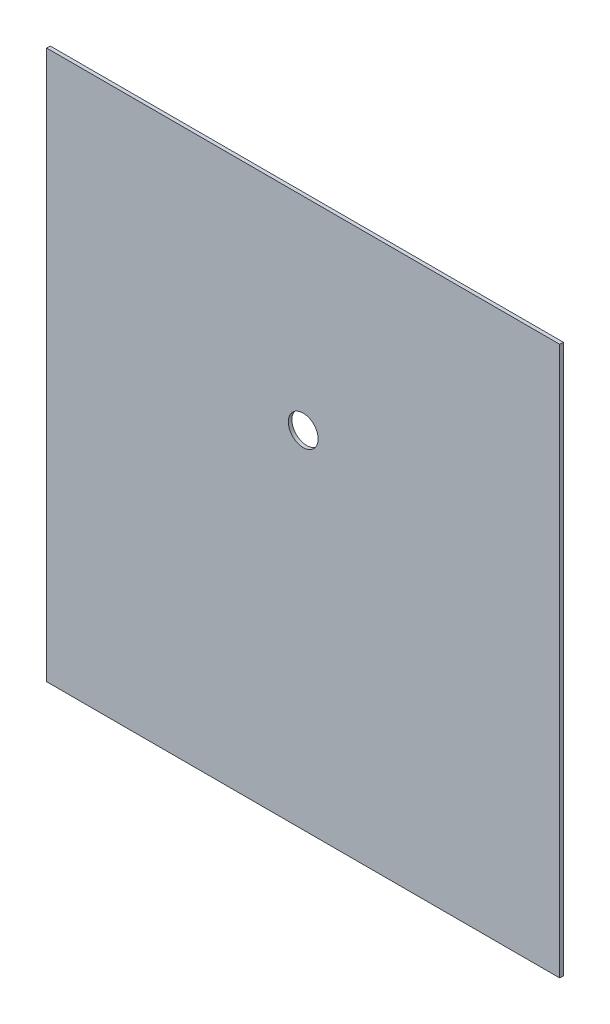
ISO-10303-21;
HEADER;
FILE_DESCRIPTION(('STEP AP214'),'2;1');
FILE_NAME('part.step','',(''),(''),'','','');
FILE_SCHEMA(('AUTOMOTIVE_DESIGN { 1 0 10303 214 1 1 1 1 }'));
ENDSEC;
DATA;
#1=APPLICATION_CONTEXT('core data for automotive mechanical design processes');
#2=APPLICATION_PROTOCOL_DEFINITION('international standard','automotive_design',2000,#1);
#3=PRODUCT_CONTEXT('',#1,'mechanical');
#4=PRODUCT('Part','Part','',(#3));
#5=PRODUCT_RELATED_PRODUCT_CATEGORY('part','',(#4));
#6=PRODUCT_DEFINITION_FORMATION('','',#4);
#7=PRODUCT_DEFINITION_CONTEXT('part definition',#1,'design');
#8=PRODUCT_DEFINITION('design','',#6,#7);
#9=PRODUCT_DEFINITION_SHAPE('','',#8);
#10=(LENGTH_UNIT() NAMED_UNIT(*) SI_UNIT(.MILLI.,.METRE.));
#11=(NAMED_UNIT(*) PLANE_ANGLE_UNIT() SI_UNIT($,.RADIAN.));
#12=(NAMED_UNIT(*) SI_UNIT($,.STERADIAN.) SOLID_ANGLE_UNIT());
#13=UNCERTAINTY_MEASURE_WITH_UNIT(LENGTH_MEASURE(1.E-05),#10,'distance_accuracy_value','');
#14=(GEOMETRIC_REPRESENTATION_CONTEXT(3) GLOBAL_UNCERTAINTY_ASSIGNED_CONTEXT((#13)) GLOBAL_UNIT_ASSIGNED_CONTEXT((#10,
#11,#12)) REPRESENTATION_CONTEXT('',''));
#15=CARTESIAN_POINT('',(0.,0.,0.));
#16=DIRECTION('',(0.,0.,1.));
#17=DIRECTION('',(1.,0.,0.));
#18=AXIS2_PLACEMENT_3D('',#15,#16,#17);
#19=CARTESIAN_POINT('',(0.,0.,3.));
#20=DIRECTION('',(0.,0.,1.));
#21=DIRECTION('',(1.,0.,0.));
#22=AXIS2_PLACEMENT_3D('',#19,#20,#21);
#23=PLANE('',#22);
#24=DIRECTION('',(0.,-1.,0.));
#25=VECTOR('',#24,1.);
#26=CARTESIAN_POINT('',(-215.,230.,3.));
#27=LINE('',#26,#25);
#28=CARTESIAN_POINT('',(-215.,230.,3.));
#29=VERTEX_POINT('',#28);
#30=CARTESIAN_POINT('',(-215.,-230.,3.));
#31=VERTEX_POINT('',#30);
#32=EDGE_CURVE('E85',#29,#31,#27,.T.);
#33=ORIENTED_EDGE('',*,*,#32,.T.);
#34=DIRECTION('',(1.,0.,0.));
#35=VECTOR('',#34,1.);
#36=CARTESIAN_POINT('',(-215.,-230.,3.));
#37=LINE('',#36,#35);
#38=CARTESIAN_POINT('',(215.,-230.,3.));
#39=VERTEX_POINT('',#38);
#40=EDGE_CURVE('E80',#31,#39,#37,.T.);
#41=ORIENTED_EDGE('',*,*,#40,.T.);
#42=DIRECTION('',(0.,1.,0.));
#43=VECTOR('',#42,1.);
#44=CARTESIAN_POINT('',(215.,230.,3.));
#45=LINE('',#44,#43);
#46=CARTESIAN_POINT('',(215.,230.,3.));
#47=VERTEX_POINT('',#46);
#48=EDGE_CURVE('E83',#39,#47,#45,.T.);
#49=ORIENTED_EDGE('',*,*,#48,.T.);
#50=DIRECTION('',(-1.,0.,0.));
#51=VECTOR('',#50,1.);
#52=CARTESIAN_POINT('',(-215.,230.,3.));
#53=LINE('',#52,#51);
#54=EDGE_CURVE('E50',#47,#29,#53,.T.);
#55=ORIENTED_EDGE('',*,*,#54,.T.);
#56=EDGE_LOOP('',(#33,#41,#49,#55));
#57=FACE_BOUND('',#56,.T.);
#58=CARTESIAN_POINT('',(0.,60.,3.));
#59=DIRECTION('',(0.,0.,1.));
#60=DIRECTION('',(1.,0.,0.));
#61=AXIS2_PLACEMENT_3D('',#58,#59,#60);
#62=CIRCLE('',#61,12.5);
#63=CARTESIAN_POINT('',(12.5,60.,3.));
#64=VERTEX_POINT('',#63);
#65=EDGE_CURVE('E100',#64,#64,#62,.T.);
#66=ORIENTED_EDGE('',*,*,#65,.F.);
#67=EDGE_LOOP('',(#66));
#68=FACE_BOUND('',#67,.T.);
#69=ADVANCED_FACE('F33',(#57,#68),#23,.T.);
#70=CARTESIAN_POINT('',(0.,0.,0.));
#71=DIRECTION('',(0.,0.,1.));
#72=DIRECTION('',(1.,0.,0.));
#73=AXIS2_PLACEMENT_3D('',#70,#71,#72);
#74=PLANE('',#73);
#75=DIRECTION('',(0.,-1.,0.));
#76=VECTOR('',#75,1.);
#77=CARTESIAN_POINT('',(-215.,230.,0.));
#78=LINE('',#77,#76);
#79=CARTESIAN_POINT('',(-215.,230.,0.));
#80=VERTEX_POINT('',#79);
#81=CARTESIAN_POINT('',(-215.,-230.,0.));
#82=VERTEX_POINT('',#81);
#83=EDGE_CURVE('E97',#80,#82,#78,.T.);
#84=ORIENTED_EDGE('',*,*,#83,.F.);
#85=DIRECTION('',(-1.,0.,0.));
#86=VECTOR('',#85,1.);
#87=CARTESIAN_POINT('',(-215.,230.,0.));
#88=LINE('',#87,#86);
#89=CARTESIAN_POINT('',(215.,230.,0.));
#90=VERTEX_POINT('',#89);
#91=EDGE_CURVE('E73',#90,#80,#88,.T.);
#92=ORIENTED_EDGE('',*,*,#91,.F.);
#93=DIRECTION('',(0.,1.,0.));
#94=VECTOR('',#93,1.);
#95=CARTESIAN_POINT('',(215.,230.,0.));
#96=LINE('',#95,#94);
#97=CARTESIAN_POINT('',(215.,-230.,0.));
#98=VERTEX_POINT('',#97);
#99=EDGE_CURVE('E67',#98,#90,#96,.T.);
#100=ORIENTED_EDGE('',*,*,#99,.F.);
#101=DIRECTION('',(1.,0.,0.));
#102=VECTOR('',#101,1.);
#103=CARTESIAN_POINT('',(-215.,-230.,0.));
#104=LINE('',#103,#102);
#105=EDGE_CURVE('E89',#82,#98,#104,.T.);
#106=ORIENTED_EDGE('',*,*,#105,.F.);
#107=EDGE_LOOP('',(#84,#92,#100,#106));
#108=FACE_BOUND('',#107,.T.);
#109=CARTESIAN_POINT('',(0.,60.,0.));
#110=DIRECTION('',(0.,0.,1.));
#111=DIRECTION('',(1.,0.,0.));
#112=AXIS2_PLACEMENT_3D('',#109,#110,#111);
#113=CIRCLE('',#112,12.5);
#114=CARTESIAN_POINT('',(12.5,60.,0.));
#115=VERTEX_POINT('',#114);
#116=EDGE_CURVE('E112',#115,#115,#113,.T.);
#117=ORIENTED_EDGE('',*,*,#116,.T.);
#118=EDGE_LOOP('',(#117));
#119=FACE_BOUND('',#118,.T.);
#120=ADVANCED_FACE('F108',(#108,#119),#74,.F.);
#121=CARTESIAN_POINT('',(-215.,230.,3.));
#122=DIRECTION('',(1.,0.,0.));
#123=DIRECTION('',(0.,1.,0.));
#124=AXIS2_PLACEMENT_3D('',#121,#122,#123);
#125=PLANE('',#124);
#126=ORIENTED_EDGE('',*,*,#83,.T.);
#127=DIRECTION('',(0.,0.,-1.));
#128=VECTOR('',#127,1.);
#129=CARTESIAN_POINT('',(-215.,-230.,3.));
#130=LINE('',#129,#128);
#131=EDGE_CURVE('E11',#31,#82,#130,.T.);
#132=ORIENTED_EDGE('',*,*,#131,.F.);
#133=ORIENTED_EDGE('',*,*,#32,.F.);
#134=DIRECTION('',(0.,0.,-1.));
#135=VECTOR('',#134,1.);
#136=CARTESIAN_POINT('',(-215.,230.,3.));
#137=LINE('',#136,#135);
#138=EDGE_CURVE('E93',#29,#80,#137,.T.);
#139=ORIENTED_EDGE('',*,*,#138,.T.);
#140=EDGE_LOOP('',(#126,#132,#133,#139));
#141=FACE_BOUND('',#140,.T.);
#142=ADVANCED_FACE('F35',(#141),#125,.F.);
#143=CARTESIAN_POINT('',(-215.,-230.,3.));
#144=DIRECTION('',(0.,1.,0.));
#145=DIRECTION('',(-1.,0.,0.));
#146=AXIS2_PLACEMENT_3D('',#143,#144,#145);
#147=PLANE('',#146);
#148=ORIENTED_EDGE('',*,*,#105,.T.);
#149=DIRECTION('',(0.,0.,-1.));
#150=VECTOR('',#149,1.);
#151=CARTESIAN_POINT('',(215.,-230.,3.));
#152=LINE('',#151,#150);
#153=EDGE_CURVE('E42',#39,#98,#152,.T.);
#154=ORIENTED_EDGE('',*,*,#153,.F.);
#155=ORIENTED_EDGE('',*,*,#40,.F.);
#156=ORIENTED_EDGE('',*,*,#131,.T.);
#157=EDGE_LOOP('',(#148,#154,#155,#156));
#158=FACE_BOUND('',#157,.T.);
#159=ADVANCED_FACE('F88',(#158),#147,.F.);
#160=CARTESIAN_POINT('',(215.,230.,3.));
#161=DIRECTION('',(-1.,0.,0.));
#162=DIRECTION('',(0.,-1.,0.));
#163=AXIS2_PLACEMENT_3D('',#160,#161,#162);
#164=PLANE('',#163);
#165=ORIENTED_EDGE('',*,*,#99,.T.);
#166=DIRECTION('',(0.,0.,-1.));
#167=VECTOR('',#166,1.);
#168=CARTESIAN_POINT('',(215.,230.,3.));
#169=LINE('',#168,#167);
#170=EDGE_CURVE('E90',#47,#90,#169,.T.);
#171=ORIENTED_EDGE('',*,*,#170,.F.);
#172=ORIENTED_EDGE('',*,*,#48,.F.);
#173=ORIENTED_EDGE('',*,*,#153,.T.);
#174=EDGE_LOOP('',(#165,#171,#172,#173));
#175=FACE_BOUND('',#174,.T.);
#176=ADVANCED_FACE('F91',(#175),#164,.F.);
#177=CARTESIAN_POINT('',(-215.,230.,3.));
#178=DIRECTION('',(0.,-1.,0.));
#179=DIRECTION('',(1.,0.,0.));
#180=AXIS2_PLACEMENT_3D('',#177,#178,#179);
#181=PLANE('',#180);
#182=ORIENTED_EDGE('',*,*,#91,.T.);
#183=ORIENTED_EDGE('',*,*,#138,.F.);
#184=ORIENTED_EDGE('',*,*,#54,.F.);
#185=ORIENTED_EDGE('',*,*,#170,.T.);
#186=EDGE_LOOP('',(#182,#183,#184,#185));
#187=FACE_BOUND('',#186,.T.);
#188=ADVANCED_FACE('F105',(#187),#181,.F.);
#189=CARTESIAN_POINT('',(0.,60.,3.));
#190=DIRECTION('',(0.,0.,-1.));
#191=DIRECTION('',(-1.,0.,0.));
#192=AXIS2_PLACEMENT_3D('',#189,#190,#191);
#193=CYLINDRICAL_SURFACE('',#192,12.5);
#194=ORIENTED_EDGE('',*,*,#65,.T.);
#195=EDGE_LOOP('',(#194));
#196=FACE_BOUND('',#195,.T.);
#197=ORIENTED_EDGE('',*,*,#116,.F.);
#198=EDGE_LOOP('',(#197));
#199=FACE_BOUND('',#198,.T.);
#200=ADVANCED_FACE('F118',(#196,#199),#193,.F.);
#201=CLOSED_SHELL('',(#69,#120,#142,#159,#176,#188,#200));
#202=MANIFOLD_SOLID_BREP('B2',#201);
#203=ADVANCED_BREP_SHAPE_REPRESENTATION('',(#18,#202),#14);
#204=SHAPE_DEFINITION_REPRESENTATION(#9,#203);
ENDSEC;
END-ISO-10303-21;
